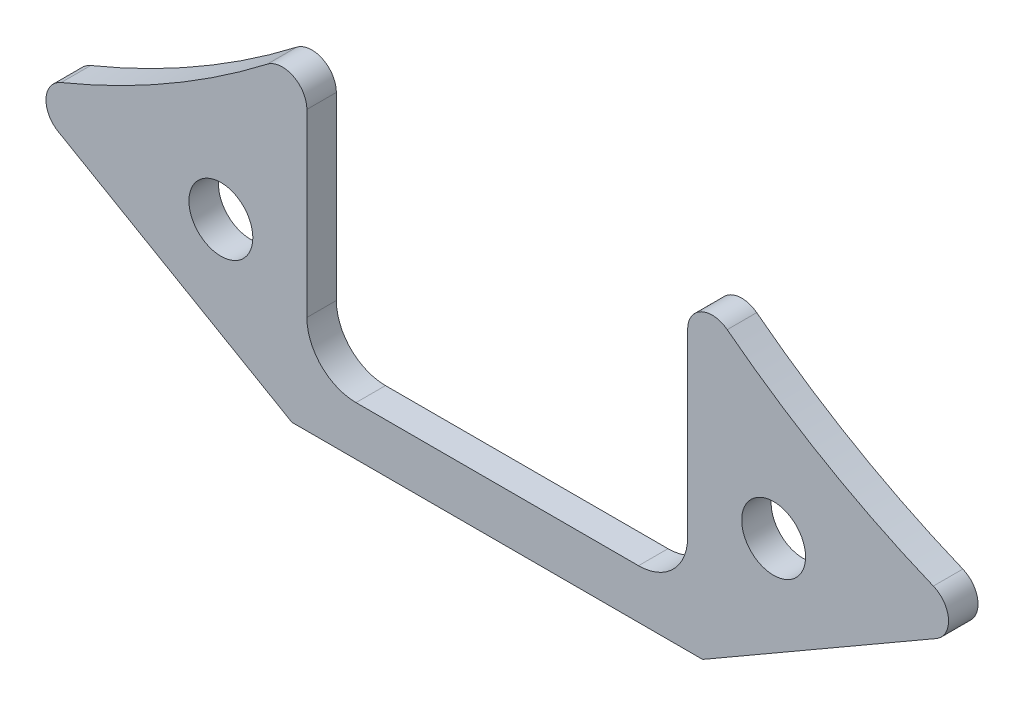
ISO-10303-21;
HEADER;
FILE_DESCRIPTION(('STEP AP214'),'2;1');
FILE_NAME('part.step','',(''),(''),'','','');
FILE_SCHEMA(('AUTOMOTIVE_DESIGN { 1 0 10303 214 1 1 1 1 }'));
ENDSEC;
DATA;
#1=APPLICATION_CONTEXT('core data for automotive mechanical design processes');
#2=APPLICATION_PROTOCOL_DEFINITION('international standard','automotive_design',2000,#1);
#3=PRODUCT_CONTEXT('',#1,'mechanical');
#4=PRODUCT('Part','Part','',(#3));
#5=PRODUCT_RELATED_PRODUCT_CATEGORY('part','',(#4));
#6=PRODUCT_DEFINITION_FORMATION('','',#4);
#7=PRODUCT_DEFINITION_CONTEXT('part definition',#1,'design');
#8=PRODUCT_DEFINITION('design','',#6,#7);
#9=PRODUCT_DEFINITION_SHAPE('','',#8);
#10=(LENGTH_UNIT() NAMED_UNIT(*) SI_UNIT(.MILLI.,.METRE.));
#11=(NAMED_UNIT(*) PLANE_ANGLE_UNIT() SI_UNIT($,.RADIAN.));
#12=(NAMED_UNIT(*) SI_UNIT($,.STERADIAN.) SOLID_ANGLE_UNIT());
#13=UNCERTAINTY_MEASURE_WITH_UNIT(LENGTH_MEASURE(1.E-05),#10,'distance_accuracy_value','');
#14=(GEOMETRIC_REPRESENTATION_CONTEXT(3) GLOBAL_UNCERTAINTY_ASSIGNED_CONTEXT((#13)) GLOBAL_UNIT_ASSIGNED_CONTEXT((#10,
#11,#12)) REPRESENTATION_CONTEXT('',''));
#15=CARTESIAN_POINT('',(0.,0.,0.));
#16=DIRECTION('',(0.,0.,1.));
#17=DIRECTION('',(1.,0.,0.));
#18=AXIS2_PLACEMENT_3D('',#15,#16,#17);
#19=CARTESIAN_POINT('',(0.,0.,1.2));
#20=DIRECTION('',(0.,0.,1.));
#21=DIRECTION('',(1.,0.,0.));
#22=AXIS2_PLACEMENT_3D('',#19,#20,#21);
#23=PLANE('',#22);
#24=DIRECTION('',(-0.86602540378444,-0.499999999999998,0.));
#25=VECTOR('',#24,1.);
#26=CARTESIAN_POINT('',(22.7769318014662,22.0991968793294,1.2));
#27=LINE('',#26,#25);
#28=CARTESIAN_POINT('',(17.8708637539956,19.2666771714596,1.2));
#29=VERTEX_POINT('',#28);
#30=CARTESIAN_POINT('',(8.3589998742614,13.775,1.2));
#31=VERTEX_POINT('',#30);
#32=EDGE_CURVE('E132',#29,#31,#27,.T.);
#33=ORIENTED_EDGE('',*,*,#32,.F.);
#34=CARTESIAN_POINT('',(17.3708637539956,20.1327025752441,1.20000000000001));
#35=DIRECTION('',(0.,0.,1.));
#36=DIRECTION('',(1.,0.,0.));
#37=AXIS2_PLACEMENT_3D('',#34,#35,#36);
#38=CIRCLE('',#37,1.);
#39=CARTESIAN_POINT('',(17.7515309324444,21.0574146922037,1.2));
#40=VERTEX_POINT('',#39);
#41=EDGE_CURVE('E226',#29,#40,#38,.T.);
#42=ORIENTED_EDGE('',*,*,#41,.T.);
#43=CARTESIAN_POINT('',(31.6499999999997,54.8194080595552,1.2));
#44=DIRECTION('',(0.,0.,1.));
#45=DIRECTION('',(-1.,0.,0.));
#46=AXIS2_PLACEMENT_3D('',#43,#44,#45);
#47=CIRCLE('',#46,36.5108153642024);
#48=CARTESIAN_POINT('',(9.36049059524987,25.9019840896638,1.2));
#49=VERTEX_POINT('',#48);
#50=EDGE_CURVE('E255',#49,#40,#47,.T.);
#51=ORIENTED_EDGE('',*,*,#50,.F.);
#52=CARTESIAN_POINT('',(8.75,25.1099605842604,1.20000000000001));
#53=DIRECTION('',(0.,0.,1.));
#54=DIRECTION('',(1.,0.,0.));
#55=AXIS2_PLACEMENT_3D('',#52,#53,#54);
#56=CIRCLE('',#55,1.);
#57=CARTESIAN_POINT('',(7.75,25.1099605842604,1.2));
#58=VERTEX_POINT('',#57);
#59=EDGE_CURVE('E53',#49,#58,#56,.T.);
#60=ORIENTED_EDGE('',*,*,#59,.T.);
#61=DIRECTION('',(0.,1.,0.));
#62=VECTOR('',#61,1.);
#63=CARTESIAN_POINT('',(7.75,30.775,1.2));
#64=LINE('',#63,#62);
#65=CARTESIAN_POINT('',(7.75,17.775,1.2));
#66=VERTEX_POINT('',#65);
#67=EDGE_CURVE('E141',#66,#58,#64,.T.);
#68=ORIENTED_EDGE('',*,*,#67,.F.);
#69=CARTESIAN_POINT('',(5.75,17.775,1.2));
#70=DIRECTION('',(0.,0.,1.));
#71=DIRECTION('',(1.,0.,0.));
#72=AXIS2_PLACEMENT_3D('',#69,#70,#71);
#73=CIRCLE('',#72,2.);
#74=CARTESIAN_POINT('',(5.75,15.775,1.2));
#75=VERTEX_POINT('',#74);
#76=EDGE_CURVE('E194',#66,#75,#73,.F.);
#77=ORIENTED_EDGE('',*,*,#76,.T.);
#78=DIRECTION('',(1.,0.,0.));
#79=VECTOR('',#78,1.);
#80=CARTESIAN_POINT('',(-7.75,15.775,1.2));
#81=LINE('',#80,#79);
#82=CARTESIAN_POINT('',(-5.75,15.775,1.2));
#83=VERTEX_POINT('',#82);
#84=EDGE_CURVE('E173',#83,#75,#81,.T.);
#85=ORIENTED_EDGE('',*,*,#84,.F.);
#86=CARTESIAN_POINT('',(-5.75,17.775,1.2));
#87=DIRECTION('',(0.,0.,1.));
#88=DIRECTION('',(1.,0.,0.));
#89=AXIS2_PLACEMENT_3D('',#86,#87,#88);
#90=CIRCLE('',#89,2.);
#91=CARTESIAN_POINT('',(-7.75,17.775,1.2));
#92=VERTEX_POINT('',#91);
#93=EDGE_CURVE('E199',#83,#92,#90,.F.);
#94=ORIENTED_EDGE('',*,*,#93,.T.);
#95=DIRECTION('',(0.,-1.,0.));
#96=VECTOR('',#95,1.);
#97=CARTESIAN_POINT('',(-7.75,30.775,1.2));
#98=LINE('',#97,#96);
#99=CARTESIAN_POINT('',(-7.75,25.1099605842604,1.2));
#100=VERTEX_POINT('',#99);
#101=EDGE_CURVE('E178',#100,#92,#98,.T.);
#102=ORIENTED_EDGE('',*,*,#101,.F.);
#103=CARTESIAN_POINT('',(-8.75,25.1099605842604,1.20000000000001));
#104=DIRECTION('',(0.,0.,1.));
#105=DIRECTION('',(1.,0.,0.));
#106=AXIS2_PLACEMENT_3D('',#103,#104,#105);
#107=CIRCLE('',#106,1.);
#108=CARTESIAN_POINT('',(-9.36049059524987,25.9019840896638,1.2));
#109=VERTEX_POINT('',#108);
#110=EDGE_CURVE('E221',#100,#109,#107,.T.);
#111=ORIENTED_EDGE('',*,*,#110,.T.);
#112=CARTESIAN_POINT('',(-31.6499999999997,54.8194080595552,1.2));
#113=DIRECTION('',(0.,0.,1.));
#114=DIRECTION('',(1.,0.,0.));
#115=AXIS2_PLACEMENT_3D('',#112,#113,#114);
#116=CIRCLE('',#115,36.5108153642024);
#117=CARTESIAN_POINT('',(-17.751530932444,21.0574146922038,1.2));
#118=VERTEX_POINT('',#117);
#119=EDGE_CURVE('E251',#118,#109,#116,.T.);
#120=ORIENTED_EDGE('',*,*,#119,.F.);
#121=CARTESIAN_POINT('',(-17.3708637539952,20.1327025752443,1.20000000000001));
#122=DIRECTION('',(0.,0.,1.));
#123=DIRECTION('',(1.,0.,0.));
#124=AXIS2_PLACEMENT_3D('',#121,#122,#123);
#125=CIRCLE('',#124,1.);
#126=CARTESIAN_POINT('',(-17.8708637539953,19.2666771714598,1.2));
#127=VERTEX_POINT('',#126);
#128=EDGE_CURVE('E223',#118,#127,#125,.T.);
#129=ORIENTED_EDGE('',*,*,#128,.T.);
#130=DIRECTION('',(-0.866025403784433,0.50000000000001,0.));
#131=VECTOR('',#130,1.);
#132=CARTESIAN_POINT('',(-22.7769318014658,22.0991968793297,1.2));
#133=LINE('',#132,#131);
#134=CARTESIAN_POINT('',(-8.35899987426088,13.775,1.2));
#135=VERTEX_POINT('',#134);
#136=EDGE_CURVE('E156',#135,#127,#133,.T.);
#137=ORIENTED_EDGE('',*,*,#136,.F.);
#138=DIRECTION('',(-1.,0.,0.));
#139=VECTOR('',#138,1.);
#140=CARTESIAN_POINT('',(-8.35899987426088,13.775,1.2));
#141=LINE('',#140,#139);
#142=EDGE_CURVE('E149',#31,#135,#141,.T.);
#143=ORIENTED_EDGE('',*,*,#142,.F.);
#144=EDGE_LOOP('',(#33,#42,#51,#60,#68,#77,#85,#94,#102,#111,#120,#129,#137,#143));
#145=FACE_BOUND('',#144,.T.);
#146=CARTESIAN_POINT('',(-11.25,19.4855715851499,1.2));
#147=DIRECTION('',(0.,0.,1.));
#148=DIRECTION('',(-1.,0.,0.));
#149=AXIS2_PLACEMENT_3D('',#146,#147,#148);
#150=CIRCLE('',#149,1.3);
#151=CARTESIAN_POINT('',(-12.55,19.4855715851499,1.2));
#152=VERTEX_POINT('',#151);
#153=EDGE_CURVE('E264',#152,#152,#150,.T.);
#154=ORIENTED_EDGE('',*,*,#153,.F.);
#155=EDGE_LOOP('',(#154));
#156=FACE_BOUND('',#155,.T.);
#157=CARTESIAN_POINT('',(11.25,19.4855715851499,1.2));
#158=DIRECTION('',(0.,0.,1.));
#159=DIRECTION('',(1.,0.,0.));
#160=AXIS2_PLACEMENT_3D('',#157,#158,#159);
#161=CIRCLE('',#160,1.3);
#162=CARTESIAN_POINT('',(12.55,19.4855715851499,1.2));
#163=VERTEX_POINT('',#162);
#164=EDGE_CURVE('E161',#163,#163,#161,.T.);
#165=ORIENTED_EDGE('',*,*,#164,.F.);
#166=EDGE_LOOP('',(#165));
#167=FACE_BOUND('',#166,.T.);
#168=ADVANCED_FACE('F32',(#145,#156,#167),#23,.T.);
#169=CARTESIAN_POINT('',(0.,0.,0.));
#170=DIRECTION('',(0.,0.,1.));
#171=DIRECTION('',(1.,0.,0.));
#172=AXIS2_PLACEMENT_3D('',#169,#170,#171);
#173=PLANE('',#172);
#174=CARTESIAN_POINT('',(-11.25,19.4855715851499,0.));
#175=DIRECTION('',(0.,0.,1.));
#176=DIRECTION('',(1.,0.,0.));
#177=AXIS2_PLACEMENT_3D('',#174,#175,#176);
#178=CIRCLE('',#177,1.3);
#179=CARTESIAN_POINT('',(-9.94999999999995,19.4855715851499,0.));
#180=VERTEX_POINT('',#179);
#181=EDGE_CURVE('E267',#180,#180,#178,.F.);
#182=ORIENTED_EDGE('',*,*,#181,.F.);
#183=EDGE_LOOP('',(#182));
#184=FACE_BOUND('',#183,.T.);
#185=CARTESIAN_POINT('',(11.25,19.4855715851499,0.));
#186=DIRECTION('',(0.,0.,1.));
#187=DIRECTION('',(1.,0.,0.));
#188=AXIS2_PLACEMENT_3D('',#185,#186,#187);
#189=CIRCLE('',#188,1.3);
#190=CARTESIAN_POINT('',(12.55,19.4855715851499,0.));
#191=VERTEX_POINT('',#190);
#192=EDGE_CURVE('E158',#191,#191,#189,.F.);
#193=ORIENTED_EDGE('',*,*,#192,.F.);
#194=EDGE_LOOP('',(#193));
#195=FACE_BOUND('',#194,.T.);
#196=CARTESIAN_POINT('',(31.6499999999997,54.8194080595552,0.));
#197=DIRECTION('',(0.,0.,1.));
#198=DIRECTION('',(1.,0.,0.));
#199=AXIS2_PLACEMENT_3D('',#196,#197,#198);
#200=CIRCLE('',#199,36.5108153642024);
#201=CARTESIAN_POINT('',(17.7515309324444,21.0574146922037,0.));
#202=VERTEX_POINT('',#201);
#203=CARTESIAN_POINT('',(9.36049059524987,25.9019840896638,0.));
#204=VERTEX_POINT('',#203);
#205=EDGE_CURVE('E261',#202,#204,#200,.F.);
#206=ORIENTED_EDGE('',*,*,#205,.F.);
#207=CARTESIAN_POINT('',(17.3708637539956,20.1327025752441,0.));
#208=DIRECTION('',(0.,0.,1.));
#209=DIRECTION('',(1.,0.,0.));
#210=AXIS2_PLACEMENT_3D('',#207,#208,#209);
#211=CIRCLE('',#210,1.);
#212=CARTESIAN_POINT('',(17.8708637539956,19.2666771714596,0.));
#213=VERTEX_POINT('',#212);
#214=EDGE_CURVE('E218',#202,#213,#211,.F.);
#215=ORIENTED_EDGE('',*,*,#214,.T.);
#216=DIRECTION('',(-0.86602540378444,-0.499999999999998,0.));
#217=VECTOR('',#216,1.);
#218=CARTESIAN_POINT('',(-3.87499999999998,6.71169687932941,0.));
#219=LINE('',#218,#217);
#220=CARTESIAN_POINT('',(8.3589998742614,13.775,0.));
#221=VERTEX_POINT('',#220);
#222=EDGE_CURVE('E204',#213,#221,#219,.T.);
#223=ORIENTED_EDGE('',*,*,#222,.T.);
#224=DIRECTION('',(1.,0.,0.));
#225=VECTOR('',#224,1.);
#226=CARTESIAN_POINT('',(-8.35899987426088,13.775,0.));
#227=LINE('',#226,#225);
#228=CARTESIAN_POINT('',(-8.35899987426088,13.775,0.));
#229=VERTEX_POINT('',#228);
#230=EDGE_CURVE('E151',#229,#221,#227,.T.);
#231=ORIENTED_EDGE('',*,*,#230,.F.);
#232=DIRECTION('',(-0.866025403784433,0.50000000000001,0.));
#233=VECTOR('',#232,1.);
#234=CARTESIAN_POINT('',(-22.7769318014658,22.0991968793297,0.));
#235=LINE('',#234,#233);
#236=CARTESIAN_POINT('',(-17.8708637539953,19.2666771714598,0.));
#237=VERTEX_POINT('',#236);
#238=EDGE_CURVE('E142',#229,#237,#235,.T.);
#239=ORIENTED_EDGE('',*,*,#238,.T.);
#240=CARTESIAN_POINT('',(-17.3708637539952,20.1327025752443,0.));
#241=DIRECTION('',(0.,0.,1.));
#242=DIRECTION('',(1.,0.,0.));
#243=AXIS2_PLACEMENT_3D('',#240,#241,#242);
#244=CIRCLE('',#243,1.);
#245=CARTESIAN_POINT('',(-17.751530932444,21.0574146922038,0.));
#246=VERTEX_POINT('',#245);
#247=EDGE_CURVE('E214',#237,#246,#244,.F.);
#248=ORIENTED_EDGE('',*,*,#247,.T.);
#249=CARTESIAN_POINT('',(-31.6499999999997,54.8194080595552,0.));
#250=DIRECTION('',(0.,0.,1.));
#251=DIRECTION('',(1.,0.,0.));
#252=AXIS2_PLACEMENT_3D('',#249,#250,#251);
#253=CIRCLE('',#252,36.5108153642024);
#254=CARTESIAN_POINT('',(-9.36049059524987,25.9019840896638,0.));
#255=VERTEX_POINT('',#254);
#256=EDGE_CURVE('E253',#255,#246,#253,.F.);
#257=ORIENTED_EDGE('',*,*,#256,.F.);
#258=CARTESIAN_POINT('',(-8.75,25.1099605842604,0.));
#259=DIRECTION('',(0.,0.,1.));
#260=DIRECTION('',(1.,0.,0.));
#261=AXIS2_PLACEMENT_3D('',#258,#259,#260);
#262=CIRCLE('',#261,1.);
#263=CARTESIAN_POINT('',(-7.75,25.1099605842604,0.));
#264=VERTEX_POINT('',#263);
#265=EDGE_CURVE('E212',#255,#264,#262,.F.);
#266=ORIENTED_EDGE('',*,*,#265,.T.);
#267=DIRECTION('',(0.,-1.,0.));
#268=VECTOR('',#267,1.);
#269=CARTESIAN_POINT('',(-7.74999999999999,0.,0.));
#270=LINE('',#269,#268);
#271=CARTESIAN_POINT('',(-7.75,17.775,0.));
#272=VERTEX_POINT('',#271);
#273=EDGE_CURVE('E176',#264,#272,#270,.T.);
#274=ORIENTED_EDGE('',*,*,#273,.T.);
#275=CARTESIAN_POINT('',(-5.75,17.775,0.));
#276=DIRECTION('',(0.,0.,1.));
#277=DIRECTION('',(1.,0.,0.));
#278=AXIS2_PLACEMENT_3D('',#275,#276,#277);
#279=CIRCLE('',#278,2.);
#280=CARTESIAN_POINT('',(-5.75,15.775,0.));
#281=VERTEX_POINT('',#280);
#282=EDGE_CURVE('E202',#272,#281,#279,.T.);
#283=ORIENTED_EDGE('',*,*,#282,.T.);
#284=DIRECTION('',(1.,0.,0.));
#285=VECTOR('',#284,1.);
#286=CARTESIAN_POINT('',(-7.75,15.775,0.));
#287=LINE('',#286,#285);
#288=CARTESIAN_POINT('',(5.75,15.775,0.));
#289=VERTEX_POINT('',#288);
#290=EDGE_CURVE('E172',#281,#289,#287,.T.);
#291=ORIENTED_EDGE('',*,*,#290,.T.);
#292=CARTESIAN_POINT('',(5.75,17.775,0.));
#293=DIRECTION('',(0.,0.,1.));
#294=DIRECTION('',(1.,0.,0.));
#295=AXIS2_PLACEMENT_3D('',#292,#293,#294);
#296=CIRCLE('',#295,2.);
#297=CARTESIAN_POINT('',(7.75,17.775,0.));
#298=VERTEX_POINT('',#297);
#299=EDGE_CURVE('E196',#289,#298,#296,.T.);
#300=ORIENTED_EDGE('',*,*,#299,.T.);
#301=DIRECTION('',(0.,1.,0.));
#302=VECTOR('',#301,1.);
#303=CARTESIAN_POINT('',(7.75,30.775,0.));
#304=LINE('',#303,#302);
#305=CARTESIAN_POINT('',(7.75,25.1099605842604,0.));
#306=VERTEX_POINT('',#305);
#307=EDGE_CURVE('E169',#298,#306,#304,.T.);
#308=ORIENTED_EDGE('',*,*,#307,.T.);
#309=CARTESIAN_POINT('',(8.75,25.1099605842604,0.));
#310=DIRECTION('',(0.,0.,1.));
#311=DIRECTION('',(1.,0.,0.));
#312=AXIS2_PLACEMENT_3D('',#309,#310,#311);
#313=CIRCLE('',#312,1.);
#314=EDGE_CURVE('E216',#306,#204,#313,.F.);
#315=ORIENTED_EDGE('',*,*,#314,.T.);
#316=EDGE_LOOP('',(#206,#215,#223,#231,#239,#248,#257,#266,#274,#283,#291,#300,#308,#315));
#317=FACE_BOUND('',#316,.T.);
#318=ADVANCED_FACE('F242',(#184,#195,#317),#173,.F.);
#319=CARTESIAN_POINT('',(-7.75,30.775,0.));
#320=DIRECTION('',(-1.,0.,0.));
#321=DIRECTION('',(0.,-1.,0.));
#322=AXIS2_PLACEMENT_3D('',#319,#320,#321);
#323=PLANE('',#322);
#324=ORIENTED_EDGE('',*,*,#273,.F.);
#325=DIRECTION('',(0.,0.,1.));
#326=VECTOR('',#325,1.);
#327=CARTESIAN_POINT('',(-7.75,25.1099605842604,0.));
#328=LINE('',#327,#326);
#329=EDGE_CURVE('E11',#264,#100,#328,.T.);
#330=ORIENTED_EDGE('',*,*,#329,.T.);
#331=ORIENTED_EDGE('',*,*,#101,.T.);
#332=DIRECTION('',(0.,0.,1.));
#333=VECTOR('',#332,1.);
#334=CARTESIAN_POINT('',(-7.75,17.775,0.));
#335=LINE('',#334,#333);
#336=EDGE_CURVE('E191',#92,#272,#335,.F.);
#337=ORIENTED_EDGE('',*,*,#336,.T.);
#338=EDGE_LOOP('',(#324,#330,#331,#337));
#339=FACE_BOUND('',#338,.T.);
#340=ADVANCED_FACE('F280',(#339),#323,.F.);
#341=CARTESIAN_POINT('',(7.75,30.775,0.));
#342=DIRECTION('',(1.,0.,0.));
#343=DIRECTION('',(0.,1.,0.));
#344=AXIS2_PLACEMENT_3D('',#341,#342,#343);
#345=PLANE('',#344);
#346=ORIENTED_EDGE('',*,*,#67,.T.);
#347=DIRECTION('',(0.,0.,1.));
#348=VECTOR('',#347,1.);
#349=CARTESIAN_POINT('',(7.75,25.1099605842604,0.));
#350=LINE('',#349,#348);
#351=EDGE_CURVE('E228',#58,#306,#350,.F.);
#352=ORIENTED_EDGE('',*,*,#351,.T.);
#353=ORIENTED_EDGE('',*,*,#307,.F.);
#354=DIRECTION('',(0.,0.,1.));
#355=VECTOR('',#354,1.);
#356=CARTESIAN_POINT('',(7.75,17.775,1.2));
#357=LINE('',#356,#355);
#358=EDGE_CURVE('E183',#298,#66,#357,.T.);
#359=ORIENTED_EDGE('',*,*,#358,.T.);
#360=EDGE_LOOP('',(#346,#352,#353,#359));
#361=FACE_BOUND('',#360,.T.);
#362=ADVANCED_FACE('F284',(#361),#345,.F.);
#363=CARTESIAN_POINT('',(-7.75,15.775,0.));
#364=DIRECTION('',(0.,-1.,0.));
#365=DIRECTION('',(0.,0.,-1.));
#366=AXIS2_PLACEMENT_3D('',#363,#364,#365);
#367=PLANE('',#366);
#368=ORIENTED_EDGE('',*,*,#84,.T.);
#369=DIRECTION('',(0.,0.,1.));
#370=VECTOR('',#369,1.);
#371=CARTESIAN_POINT('',(5.75,15.775,0.));
#372=LINE('',#371,#370);
#373=EDGE_CURVE('E189',#75,#289,#372,.F.);
#374=ORIENTED_EDGE('',*,*,#373,.T.);
#375=ORIENTED_EDGE('',*,*,#290,.F.);
#376=DIRECTION('',(0.,0.,1.));
#377=VECTOR('',#376,1.);
#378=CARTESIAN_POINT('',(-5.75,15.775,1.2));
#379=LINE('',#378,#377);
#380=EDGE_CURVE('E186',#281,#83,#379,.T.);
#381=ORIENTED_EDGE('',*,*,#380,.T.);
#382=EDGE_LOOP('',(#368,#374,#375,#381));
#383=FACE_BOUND('',#382,.T.);
#384=ADVANCED_FACE('F291',(#383),#367,.F.);
#385=CARTESIAN_POINT('',(5.75,17.775,0.));
#386=DIRECTION('',(0.,0.,-1.));
#387=DIRECTION('',(-1.,0.,0.));
#388=AXIS2_PLACEMENT_3D('',#385,#386,#387);
#389=CYLINDRICAL_SURFACE('',#388,2.);
#390=ORIENTED_EDGE('',*,*,#299,.F.);
#391=ORIENTED_EDGE('',*,*,#373,.F.);
#392=ORIENTED_EDGE('',*,*,#76,.F.);
#393=ORIENTED_EDGE('',*,*,#358,.F.);
#394=EDGE_LOOP('',(#390,#391,#392,#393));
#395=FACE_BOUND('',#394,.T.);
#396=ADVANCED_FACE('F287',(#395),#389,.F.);
#397=CARTESIAN_POINT('',(-5.75,17.775,0.));
#398=DIRECTION('',(0.,0.,-1.));
#399=DIRECTION('',(-1.,0.,0.));
#400=AXIS2_PLACEMENT_3D('',#397,#398,#399);
#401=CYLINDRICAL_SURFACE('',#400,2.);
#402=ORIENTED_EDGE('',*,*,#282,.F.);
#403=ORIENTED_EDGE('',*,*,#336,.F.);
#404=ORIENTED_EDGE('',*,*,#93,.F.);
#405=ORIENTED_EDGE('',*,*,#380,.F.);
#406=EDGE_LOOP('',(#402,#403,#404,#405));
#407=FACE_BOUND('',#406,.T.);
#408=ADVANCED_FACE('F290',(#407),#401,.F.);
#409=CARTESIAN_POINT('',(22.7769318014662,22.0991968793294,0.));
#410=DIRECTION('',(-0.499999999999998,0.86602540378444,0.));
#411=DIRECTION('',(-0.86602540378444,-0.499999999999998,0.));
#412=AXIS2_PLACEMENT_3D('',#409,#410,#411);
#413=PLANE('',#412);
#414=ORIENTED_EDGE('',*,*,#222,.F.);
#415=DIRECTION('',(0.,0.,1.));
#416=VECTOR('',#415,1.);
#417=CARTESIAN_POINT('',(17.8708637539956,19.2666771714596,0.));
#418=LINE('',#417,#416);
#419=EDGE_CURVE('E138',#213,#29,#418,.T.);
#420=ORIENTED_EDGE('',*,*,#419,.T.);
#421=ORIENTED_EDGE('',*,*,#32,.T.);
#422=DIRECTION('',(0.,0.,1.));
#423=VECTOR('',#422,1.);
#424=CARTESIAN_POINT('',(8.3589998742614,13.775,-74.6159452728145));
#425=LINE('',#424,#423);
#426=EDGE_CURVE('E136',#221,#31,#425,.T.);
#427=ORIENTED_EDGE('',*,*,#426,.F.);
#428=EDGE_LOOP('',(#414,#420,#421,#427));
#429=FACE_BOUND('',#428,.T.);
#430=ADVANCED_FACE('F135',(#429),#413,.F.);
#431=CARTESIAN_POINT('',(-22.7769318014658,22.0991968793297,0.));
#432=DIRECTION('',(0.50000000000001,0.866025403784433,0.));
#433=DIRECTION('',(-0.866025403784433,0.50000000000001,0.));
#434=AXIS2_PLACEMENT_3D('',#431,#432,#433);
#435=PLANE('',#434);
#436=ORIENTED_EDGE('',*,*,#136,.T.);
#437=DIRECTION('',(0.,0.,1.));
#438=VECTOR('',#437,1.);
#439=CARTESIAN_POINT('',(-17.8708637539953,19.2666771714598,0.));
#440=LINE('',#439,#438);
#441=EDGE_CURVE('E40',#127,#237,#440,.F.);
#442=ORIENTED_EDGE('',*,*,#441,.T.);
#443=ORIENTED_EDGE('',*,*,#238,.F.);
#444=DIRECTION('',(0.,0.,1.));
#445=VECTOR('',#444,1.);
#446=CARTESIAN_POINT('',(-8.35899987426088,13.775,-74.6159452728145));
#447=LINE('',#446,#445);
#448=EDGE_CURVE('E152',#229,#135,#447,.T.);
#449=ORIENTED_EDGE('',*,*,#448,.T.);
#450=EDGE_LOOP('',(#436,#442,#443,#449));
#451=FACE_BOUND('',#450,.T.);
#452=ADVANCED_FACE('F237',(#451),#435,.F.);
#453=CARTESIAN_POINT('',(-8.35899987426088,13.775,-74.6159452728145));
#454=DIRECTION('',(0.,1.,0.));
#455=DIRECTION('',(0.,0.,1.));
#456=AXIS2_PLACEMENT_3D('',#453,#454,#455);
#457=PLANE('',#456);
#458=ORIENTED_EDGE('',*,*,#230,.T.);
#459=ORIENTED_EDGE('',*,*,#426,.T.);
#460=ORIENTED_EDGE('',*,*,#142,.T.);
#461=ORIENTED_EDGE('',*,*,#448,.F.);
#462=EDGE_LOOP('',(#458,#459,#460,#461));
#463=FACE_BOUND('',#462,.T.);
#464=ADVANCED_FACE('F147',(#463),#457,.F.);
#465=CARTESIAN_POINT('',(11.25,19.4855715851499,-3.67695526217005));
#466=DIRECTION('',(0.,0.,1.));
#467=DIRECTION('',(1.,0.,0.));
#468=AXIS2_PLACEMENT_3D('',#465,#466,#467);
#469=CYLINDRICAL_SURFACE('',#468,1.3);
#470=ORIENTED_EDGE('',*,*,#192,.T.);
#471=EDGE_LOOP('',(#470));
#472=FACE_BOUND('',#471,.T.);
#473=ORIENTED_EDGE('',*,*,#164,.T.);
#474=EDGE_LOOP('',(#473));
#475=FACE_BOUND('',#474,.T.);
#476=ADVANCED_FACE('F273',(#472,#475),#469,.F.);
#477=CARTESIAN_POINT('',(-11.25,19.4855715851499,-3.67695526217005));
#478=DIRECTION('',(0.,0.,1.));
#479=DIRECTION('',(1.,0.,0.));
#480=AXIS2_PLACEMENT_3D('',#477,#478,#479);
#481=CYLINDRICAL_SURFACE('',#480,1.3);
#482=ORIENTED_EDGE('',*,*,#181,.T.);
#483=EDGE_LOOP('',(#482));
#484=FACE_BOUND('',#483,.T.);
#485=ORIENTED_EDGE('',*,*,#153,.T.);
#486=EDGE_LOOP('',(#485));
#487=FACE_BOUND('',#486,.T.);
#488=ADVANCED_FACE('F332',(#484,#487),#481,.F.);
#489=CARTESIAN_POINT('',(-31.6499999999997,54.8194080595552,-154.647164728898));
#490=DIRECTION('',(0.,0.,1.));
#491=DIRECTION('',(1.,0.,0.));
#492=AXIS2_PLACEMENT_3D('',#489,#490,#491);
#493=CYLINDRICAL_SURFACE('',#492,36.5108153642024);
#494=ORIENTED_EDGE('',*,*,#256,.T.);
#495=DIRECTION('',(0.,0.,1.));
#496=VECTOR('',#495,1.);
#497=CARTESIAN_POINT('',(-17.751530932444,21.0574146922038,-154.647164728898));
#498=LINE('',#497,#496);
#499=EDGE_CURVE('E233',#246,#118,#498,.T.);
#500=ORIENTED_EDGE('',*,*,#499,.T.);
#501=ORIENTED_EDGE('',*,*,#119,.T.);
#502=DIRECTION('',(0.,0.,1.));
#503=VECTOR('',#502,1.);
#504=CARTESIAN_POINT('',(-9.36049059524986,25.9019840896638,-154.647164728898));
#505=LINE('',#504,#503);
#506=EDGE_CURVE('E230',#109,#255,#505,.F.);
#507=ORIENTED_EDGE('',*,*,#506,.T.);
#508=EDGE_LOOP('',(#494,#500,#501,#507));
#509=FACE_BOUND('',#508,.T.);
#510=ADVANCED_FACE('F250',(#509),#493,.F.);
#511=CARTESIAN_POINT('',(31.6499999999997,54.8194080595552,-154.647164728898));
#512=DIRECTION('',(0.,0.,1.));
#513=DIRECTION('',(1.,0.,0.));
#514=AXIS2_PLACEMENT_3D('',#511,#512,#513);
#515=CYLINDRICAL_SURFACE('',#514,36.5108153642024);
#516=ORIENTED_EDGE('',*,*,#50,.T.);
#517=DIRECTION('',(0.,0.,1.));
#518=VECTOR('',#517,1.);
#519=CARTESIAN_POINT('',(17.7515309324444,21.0574146922037,-154.647164728898));
#520=LINE('',#519,#518);
#521=EDGE_CURVE('E209',#40,#202,#520,.F.);
#522=ORIENTED_EDGE('',*,*,#521,.T.);
#523=ORIENTED_EDGE('',*,*,#205,.T.);
#524=DIRECTION('',(0.,0.,1.));
#525=VECTOR('',#524,1.);
#526=CARTESIAN_POINT('',(9.36049059524986,25.9019840896638,-154.647164728898));
#527=LINE('',#526,#525);
#528=EDGE_CURVE('E206',#204,#49,#527,.T.);
#529=ORIENTED_EDGE('',*,*,#528,.T.);
#530=EDGE_LOOP('',(#516,#522,#523,#529));
#531=FACE_BOUND('',#530,.T.);
#532=ADVANCED_FACE('F300',(#531),#515,.F.);
#533=CARTESIAN_POINT('',(17.3708637539956,20.1327025752441,-154.647164728898));
#534=DIRECTION('',(0.,0.,1.));
#535=DIRECTION('',(1.,0.,0.));
#536=AXIS2_PLACEMENT_3D('',#533,#534,#535);
#537=CYLINDRICAL_SURFACE('',#536,1.);
#538=ORIENTED_EDGE('',*,*,#41,.F.);
#539=ORIENTED_EDGE('',*,*,#419,.F.);
#540=ORIENTED_EDGE('',*,*,#214,.F.);
#541=ORIENTED_EDGE('',*,*,#521,.F.);
#542=EDGE_LOOP('',(#538,#539,#540,#541));
#543=FACE_BOUND('',#542,.T.);
#544=ADVANCED_FACE('F296',(#543),#537,.T.);
#545=CARTESIAN_POINT('',(8.75,25.1099605842604,-154.647164728898));
#546=DIRECTION('',(0.,0.,1.));
#547=DIRECTION('',(1.,0.,0.));
#548=AXIS2_PLACEMENT_3D('',#545,#546,#547);
#549=CYLINDRICAL_SURFACE('',#548,1.);
#550=ORIENTED_EDGE('',*,*,#314,.F.);
#551=ORIENTED_EDGE('',*,*,#351,.F.);
#552=ORIENTED_EDGE('',*,*,#59,.F.);
#553=ORIENTED_EDGE('',*,*,#528,.F.);
#554=EDGE_LOOP('',(#550,#551,#552,#553));
#555=FACE_BOUND('',#554,.T.);
#556=ADVANCED_FACE('F299',(#555),#549,.T.);
#557=CARTESIAN_POINT('',(-17.3708637539952,20.1327025752443,-154.647164728898));
#558=DIRECTION('',(0.,0.,1.));
#559=DIRECTION('',(1.,0.,0.));
#560=AXIS2_PLACEMENT_3D('',#557,#558,#559);
#561=CYLINDRICAL_SURFACE('',#560,1.);
#562=ORIENTED_EDGE('',*,*,#247,.F.);
#563=ORIENTED_EDGE('',*,*,#441,.F.);
#564=ORIENTED_EDGE('',*,*,#128,.F.);
#565=ORIENTED_EDGE('',*,*,#499,.F.);
#566=EDGE_LOOP('',(#562,#563,#564,#565));
#567=FACE_BOUND('',#566,.T.);
#568=ADVANCED_FACE('F246',(#567),#561,.T.);
#569=CARTESIAN_POINT('',(-8.75,25.1099605842604,-154.647164728898));
#570=DIRECTION('',(0.,0.,1.));
#571=DIRECTION('',(1.,0.,0.));
#572=AXIS2_PLACEMENT_3D('',#569,#570,#571);
#573=CYLINDRICAL_SURFACE('',#572,1.);
#574=ORIENTED_EDGE('',*,*,#110,.F.);
#575=ORIENTED_EDGE('',*,*,#329,.F.);
#576=ORIENTED_EDGE('',*,*,#265,.F.);
#577=ORIENTED_EDGE('',*,*,#506,.F.);
#578=EDGE_LOOP('',(#574,#575,#576,#577));
#579=FACE_BOUND('',#578,.T.);
#580=ADVANCED_FACE('F34',(#579),#573,.T.);
#581=CLOSED_SHELL('',(#168,#318,#340,#362,#384,#396,#408,#430,#452,#464,#476,#488,#510,#532,
#544,#556,#568,#580));
#582=MANIFOLD_SOLID_BREP('B2',#581);
#583=ADVANCED_BREP_SHAPE_REPRESENTATION('',(#18,#582),#14);
#584=SHAPE_DEFINITION_REPRESENTATION(#9,#583);
ENDSEC;
END-ISO-10303-21;
